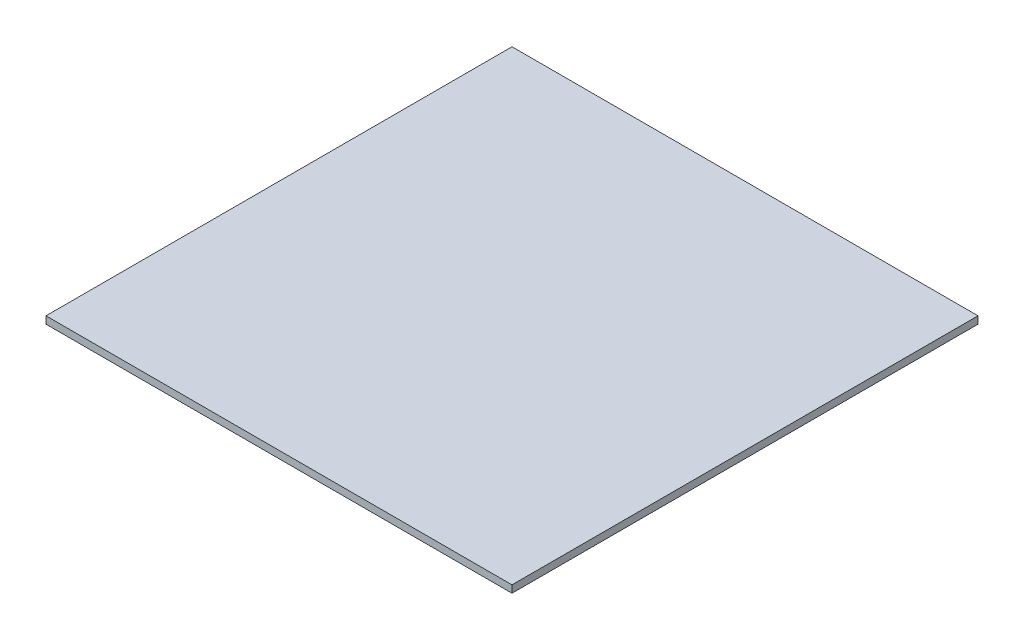
ISO-10303-21;
HEADER;
FILE_DESCRIPTION(('STEP AP214'),'2;1');
FILE_NAME('part.step','',(''),(''),'','','');
FILE_SCHEMA(('AUTOMOTIVE_DESIGN { 1 0 10303 214 1 1 1 1 }'));
ENDSEC;
DATA;
#1=APPLICATION_CONTEXT('core data for automotive mechanical design processes');
#2=APPLICATION_PROTOCOL_DEFINITION('international standard','automotive_design',2000,#1);
#3=PRODUCT_CONTEXT('',#1,'mechanical');
#4=PRODUCT('Part','Part','',(#3));
#5=PRODUCT_RELATED_PRODUCT_CATEGORY('part','',(#4));
#6=PRODUCT_DEFINITION_FORMATION('','',#4);
#7=PRODUCT_DEFINITION_CONTEXT('part definition',#1,'design');
#8=PRODUCT_DEFINITION('design','',#6,#7);
#9=PRODUCT_DEFINITION_SHAPE('','',#8);
#10=(LENGTH_UNIT() NAMED_UNIT(*) SI_UNIT(.MILLI.,.METRE.));
#11=(NAMED_UNIT(*) PLANE_ANGLE_UNIT() SI_UNIT($,.RADIAN.));
#12=(NAMED_UNIT(*) SI_UNIT($,.STERADIAN.) SOLID_ANGLE_UNIT());
#13=UNCERTAINTY_MEASURE_WITH_UNIT(LENGTH_MEASURE(1.E-05),#10,'distance_accuracy_value','');
#14=(GEOMETRIC_REPRESENTATION_CONTEXT(3) GLOBAL_UNCERTAINTY_ASSIGNED_CONTEXT((#13)) GLOBAL_UNIT_ASSIGNED_CONTEXT((#10,
#11,#12)) REPRESENTATION_CONTEXT('',''));
#15=CARTESIAN_POINT('',(0.,0.,0.));
#16=DIRECTION('',(0.,0.,1.));
#17=DIRECTION('',(1.,0.,0.));
#18=AXIS2_PLACEMENT_3D('',#15,#16,#17);
#19=CARTESIAN_POINT('',(-152.4,2.38125,152.4));
#20=DIRECTION('',(-1.,0.,0.));
#21=DIRECTION('',(0.,0.,1.));
#22=AXIS2_PLACEMENT_3D('',#19,#20,#21);
#23=PLANE('',#22);
#24=DIRECTION('',(0.,0.,-1.));
#25=VECTOR('',#24,1.);
#26=CARTESIAN_POINT('',(-152.4,-2.38125,152.4));
#27=LINE('',#26,#25);
#28=CARTESIAN_POINT('',(-152.4,-2.38125,152.4));
#29=VERTEX_POINT('',#28);
#30=CARTESIAN_POINT('',(-152.4,-2.38125,-152.4));
#31=VERTEX_POINT('',#30);
#32=EDGE_CURVE('E98',#29,#31,#27,.T.);
#33=ORIENTED_EDGE('',*,*,#32,.F.);
#34=DIRECTION('',(0.,-1.,0.));
#35=VECTOR('',#34,1.);
#36=CARTESIAN_POINT('',(-152.4,2.38125,152.4));
#37=LINE('',#36,#35);
#38=CARTESIAN_POINT('',(-152.4,2.38125,152.4));
#39=VERTEX_POINT('',#38);
#40=EDGE_CURVE('E11',#39,#29,#37,.T.);
#41=ORIENTED_EDGE('',*,*,#40,.F.);
#42=DIRECTION('',(0.,0.,-1.));
#43=VECTOR('',#42,1.);
#44=CARTESIAN_POINT('',(-152.4,2.38125,152.4));
#45=LINE('',#44,#43);
#46=CARTESIAN_POINT('',(-152.4,2.38125,-152.4));
#47=VERTEX_POINT('',#46);
#48=EDGE_CURVE('E93',#39,#47,#45,.T.);
#49=ORIENTED_EDGE('',*,*,#48,.T.);
#50=DIRECTION('',(0.,-1.,0.));
#51=VECTOR('',#50,1.);
#52=CARTESIAN_POINT('',(-152.4,2.38125,-152.4));
#53=LINE('',#52,#51);
#54=EDGE_CURVE('E36',#47,#31,#53,.T.);
#55=ORIENTED_EDGE('',*,*,#54,.T.);
#56=EDGE_LOOP('',(#33,#41,#49,#55));
#57=FACE_BOUND('',#56,.T.);
#58=ADVANCED_FACE('F33',(#57),#23,.T.);
#59=CARTESIAN_POINT('',(-152.4,2.38125,152.4));
#60=DIRECTION('',(0.,0.,-1.));
#61=DIRECTION('',(-1.,0.,0.));
#62=AXIS2_PLACEMENT_3D('',#59,#60,#61);
#63=PLANE('',#62);
#64=DIRECTION('',(1.,0.,0.));
#65=VECTOR('',#64,1.);
#66=CARTESIAN_POINT('',(-152.4,-2.38125,152.4));
#67=LINE('',#66,#65);
#68=CARTESIAN_POINT('',(152.4,-2.38125,152.4));
#69=VERTEX_POINT('',#68);
#70=EDGE_CURVE('E66',#29,#69,#67,.T.);
#71=ORIENTED_EDGE('',*,*,#70,.T.);
#72=DIRECTION('',(0.,-1.,0.));
#73=VECTOR('',#72,1.);
#74=CARTESIAN_POINT('',(152.4,2.38125,152.4));
#75=LINE('',#74,#73);
#76=CARTESIAN_POINT('',(152.4,2.38125,152.4));
#77=VERTEX_POINT('',#76);
#78=EDGE_CURVE('E42',#77,#69,#75,.T.);
#79=ORIENTED_EDGE('',*,*,#78,.F.);
#80=DIRECTION('',(1.,0.,0.));
#81=VECTOR('',#80,1.);
#82=CARTESIAN_POINT('',(-152.4,2.38125,152.4));
#83=LINE('',#82,#81);
#84=EDGE_CURVE('E83',#39,#77,#83,.T.);
#85=ORIENTED_EDGE('',*,*,#84,.F.);
#86=ORIENTED_EDGE('',*,*,#40,.T.);
#87=EDGE_LOOP('',(#71,#79,#85,#86));
#88=FACE_BOUND('',#87,.T.);
#89=ADVANCED_FACE('F108',(#88),#63,.F.);
#90=CARTESIAN_POINT('',(152.4,2.38125,152.4));
#91=DIRECTION('',(-1.,0.,0.));
#92=DIRECTION('',(0.,0.,1.));
#93=AXIS2_PLACEMENT_3D('',#90,#91,#92);
#94=PLANE('',#93);
#95=DIRECTION('',(0.,0.,-1.));
#96=VECTOR('',#95,1.);
#97=CARTESIAN_POINT('',(152.4,-2.38125,152.4));
#98=LINE('',#97,#96);
#99=CARTESIAN_POINT('',(152.4,-2.38125,-152.4));
#100=VERTEX_POINT('',#99);
#101=EDGE_CURVE('E90',#69,#100,#98,.T.);
#102=ORIENTED_EDGE('',*,*,#101,.T.);
#103=DIRECTION('',(0.,-1.,0.));
#104=VECTOR('',#103,1.);
#105=CARTESIAN_POINT('',(152.4,2.38125,-152.4));
#106=LINE('',#105,#104);
#107=CARTESIAN_POINT('',(152.4,2.38125,-152.4));
#108=VERTEX_POINT('',#107);
#109=EDGE_CURVE('E87',#108,#100,#106,.T.);
#110=ORIENTED_EDGE('',*,*,#109,.F.);
#111=DIRECTION('',(0.,0.,-1.));
#112=VECTOR('',#111,1.);
#113=CARTESIAN_POINT('',(152.4,2.38125,152.4));
#114=LINE('',#113,#112);
#115=EDGE_CURVE('E78',#77,#108,#114,.T.);
#116=ORIENTED_EDGE('',*,*,#115,.F.);
#117=ORIENTED_EDGE('',*,*,#78,.T.);
#118=EDGE_LOOP('',(#102,#110,#116,#117));
#119=FACE_BOUND('',#118,.T.);
#120=ADVANCED_FACE('F88',(#119),#94,.F.);
#121=CARTESIAN_POINT('',(-152.4,2.38125,-152.4));
#122=DIRECTION('',(0.,0.,-1.));
#123=DIRECTION('',(-1.,0.,0.));
#124=AXIS2_PLACEMENT_3D('',#121,#122,#123);
#125=PLANE('',#124);
#126=DIRECTION('',(1.,0.,0.));
#127=VECTOR('',#126,1.);
#128=CARTESIAN_POINT('',(-152.4,-2.38125,-152.4));
#129=LINE('',#128,#127);
#130=EDGE_CURVE('E101',#31,#100,#129,.T.);
#131=ORIENTED_EDGE('',*,*,#130,.F.);
#132=ORIENTED_EDGE('',*,*,#54,.F.);
#133=DIRECTION('',(1.,0.,0.));
#134=VECTOR('',#133,1.);
#135=CARTESIAN_POINT('',(-152.4,2.38125,-152.4));
#136=LINE('',#135,#134);
#137=EDGE_CURVE('E82',#47,#108,#136,.T.);
#138=ORIENTED_EDGE('',*,*,#137,.T.);
#139=ORIENTED_EDGE('',*,*,#109,.T.);
#140=EDGE_LOOP('',(#131,#132,#138,#139));
#141=FACE_BOUND('',#140,.T.);
#142=ADVANCED_FACE('F92',(#141),#125,.T.);
#143=CARTESIAN_POINT('',(0.,2.38125,0.));
#144=DIRECTION('',(0.,-1.,0.));
#145=DIRECTION('',(0.,0.,-1.));
#146=AXIS2_PLACEMENT_3D('',#143,#144,#145);
#147=PLANE('',#146);
#148=ORIENTED_EDGE('',*,*,#48,.F.);
#149=ORIENTED_EDGE('',*,*,#84,.T.);
#150=ORIENTED_EDGE('',*,*,#115,.T.);
#151=ORIENTED_EDGE('',*,*,#137,.F.);
#152=EDGE_LOOP('',(#148,#149,#150,#151));
#153=FACE_BOUND('',#152,.T.);
#154=ADVANCED_FACE('F81',(#153),#147,.F.);
#155=CARTESIAN_POINT('',(0.,-2.38125,0.));
#156=DIRECTION('',(0.,-1.,0.));
#157=DIRECTION('',(0.,0.,-1.));
#158=AXIS2_PLACEMENT_3D('',#155,#156,#157);
#159=PLANE('',#158);
#160=ORIENTED_EDGE('',*,*,#32,.T.);
#161=ORIENTED_EDGE('',*,*,#130,.T.);
#162=ORIENTED_EDGE('',*,*,#101,.F.);
#163=ORIENTED_EDGE('',*,*,#70,.F.);
#164=EDGE_LOOP('',(#160,#161,#162,#163));
#165=FACE_BOUND('',#164,.T.);
#166=ADVANCED_FACE('F106',(#165),#159,.T.);
#167=CLOSED_SHELL('',(#58,#89,#120,#142,#154,#166));
#168=MANIFOLD_SOLID_BREP('B2',#167);
#169=ADVANCED_BREP_SHAPE_REPRESENTATION('',(#18,#168),#14);
#170=SHAPE_DEFINITION_REPRESENTATION(#9,#169);
ENDSEC;
END-ISO-10303-21;
